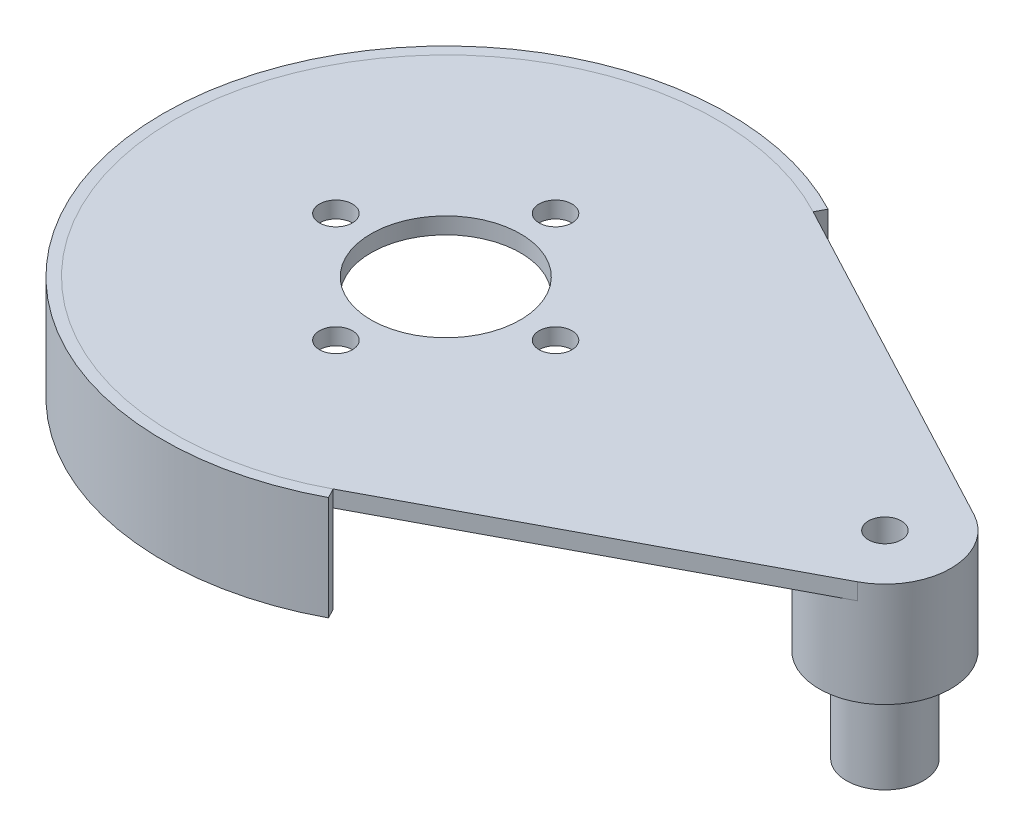
ISO-10303-21;
HEADER;
FILE_DESCRIPTION(('STEP AP214'),'2;1');
FILE_NAME('part.step','',(''),(''),'','','');
FILE_SCHEMA(('AUTOMOTIVE_DESIGN { 1 0 10303 214 1 1 1 1 }'));
ENDSEC;
DATA;
#1=APPLICATION_CONTEXT('core data for automotive mechanical design processes');
#2=APPLICATION_PROTOCOL_DEFINITION('international standard','automotive_design',2000,#1);
#3=PRODUCT_CONTEXT('',#1,'mechanical');
#4=PRODUCT('Part','Part','',(#3));
#5=PRODUCT_RELATED_PRODUCT_CATEGORY('part','',(#4));
#6=PRODUCT_DEFINITION_FORMATION('','',#4);
#7=PRODUCT_DEFINITION_CONTEXT('part definition',#1,'design');
#8=PRODUCT_DEFINITION('design','',#6,#7);
#9=PRODUCT_DEFINITION_SHAPE('','',#8);
#10=(LENGTH_UNIT() NAMED_UNIT(*) SI_UNIT(.MILLI.,.METRE.));
#11=(NAMED_UNIT(*) PLANE_ANGLE_UNIT() SI_UNIT($,.RADIAN.));
#12=(NAMED_UNIT(*) SI_UNIT($,.STERADIAN.) SOLID_ANGLE_UNIT());
#13=UNCERTAINTY_MEASURE_WITH_UNIT(LENGTH_MEASURE(1.E-05),#10,'distance_accuracy_value','');
#14=(GEOMETRIC_REPRESENTATION_CONTEXT(3) GLOBAL_UNCERTAINTY_ASSIGNED_CONTEXT((#13)) GLOBAL_UNIT_ASSIGNED_CONTEXT((#10,
#11,#12)) REPRESENTATION_CONTEXT('',''));
#15=CARTESIAN_POINT('',(0.,0.,0.));
#16=DIRECTION('',(0.,0.,1.));
#17=DIRECTION('',(1.,0.,0.));
#18=AXIS2_PLACEMENT_3D('',#15,#16,#17);
#19=CARTESIAN_POINT('',(0.,1.5,0.));
#20=DIRECTION('',(0.883330876568911,0.,-0.46875));
#21=DIRECTION('',(-0.46875,0.,-0.883330876568911));
#22=AXIS2_PLACEMENT_3D('',#19,#20,#21);
#23=PLANE('',#22);
#24=DIRECTION('',(0.,-1.,0.));
#25=VECTOR('',#24,1.);
#26=CARTESIAN_POINT('',(12.0703125,1.5,22.7457700716494));
#27=LINE('',#26,#25);
#28=CARTESIAN_POINT('',(12.0703125,1.5,22.7457700716494));
#29=VERTEX_POINT('',#28);
#30=CARTESIAN_POINT('',(12.0703125,-8.,22.7457700716494));
#31=VERTEX_POINT('',#30);
#32=EDGE_CURVE('E56',#29,#31,#27,.T.);
#33=ORIENTED_EDGE('',*,*,#32,.T.);
#34=DIRECTION('',(0.46875,0.,0.883330876568911));
#35=VECTOR('',#34,1.);
#36=CARTESIAN_POINT('',(0.,-8.,0.));
#37=LINE('',#36,#35);
#38=CARTESIAN_POINT('',(11.6015625,-8.,21.8624391950805));
#39=VERTEX_POINT('',#38);
#40=EDGE_CURVE('E93',#39,#31,#37,.T.);
#41=ORIENTED_EDGE('',*,*,#40,.F.);
#42=DIRECTION('',(0.,-1.,0.));
#43=VECTOR('',#42,1.);
#44=CARTESIAN_POINT('',(11.6015625,1.5,21.8624391950805));
#45=LINE('',#44,#43);
#46=CARTESIAN_POINT('',(11.6015625,1.5,21.8624391950805));
#47=VERTEX_POINT('',#46);
#48=EDGE_CURVE('E12',#47,#39,#45,.T.);
#49=ORIENTED_EDGE('',*,*,#48,.F.);
#50=DIRECTION('',(0.46875,0.,0.883330876568911));
#51=VECTOR('',#50,1.);
#52=CARTESIAN_POINT('',(0.,1.5,0.));
#53=LINE('',#52,#51);
#54=EDGE_CURVE('E95',#47,#29,#53,.T.);
#55=ORIENTED_EDGE('',*,*,#54,.T.);
#56=EDGE_LOOP('',(#33,#41,#49,#55));
#57=FACE_BOUND('',#56,.T.);
#58=ADVANCED_FACE('F53',(#57),#23,.T.);
#59=CARTESIAN_POINT('',(0.,1.5,0.));
#60=DIRECTION('',(0.,-1.,0.));
#61=DIRECTION('',(0.,0.,-1.));
#62=AXIS2_PLACEMENT_3D('',#59,#60,#61);
#63=CYLINDRICAL_SURFACE('',#62,24.75);
#64=ORIENTED_EDGE('',*,*,#48,.T.);
#65=CARTESIAN_POINT('',(0.,-8.,0.));
#66=DIRECTION('',(0.,-1.,0.));
#67=DIRECTION('',(0.,0.,-1.));
#68=AXIS2_PLACEMENT_3D('',#65,#66,#67);
#69=CIRCLE('',#68,24.75);
#70=CARTESIAN_POINT('',(11.6015625,-8.,-21.8624391950806));
#71=VERTEX_POINT('',#70);
#72=EDGE_CURVE('E111',#39,#71,#69,.T.);
#73=ORIENTED_EDGE('',*,*,#72,.T.);
#74=DIRECTION('',(0.,-1.,0.));
#75=VECTOR('',#74,1.);
#76=CARTESIAN_POINT('',(11.6015625,1.5,-21.8624391950806));
#77=LINE('',#76,#75);
#78=CARTESIAN_POINT('',(11.6015625,1.5,-21.8624391950806));
#79=VERTEX_POINT('',#78);
#80=EDGE_CURVE('E61',#79,#71,#77,.T.);
#81=ORIENTED_EDGE('',*,*,#80,.F.);
#82=CARTESIAN_POINT('',(0.,1.5,0.));
#83=DIRECTION('',(0.,-1.,0.));
#84=DIRECTION('',(0.,0.,-1.));
#85=AXIS2_PLACEMENT_3D('',#82,#83,#84);
#86=CIRCLE('',#85,24.75);
#87=EDGE_CURVE('E74',#47,#79,#86,.T.);
#88=ORIENTED_EDGE('',*,*,#87,.F.);
#89=EDGE_LOOP('',(#64,#73,#81,#88));
#90=FACE_BOUND('',#89,.T.);
#91=ADVANCED_FACE('F126',(#90),#63,.F.);
#92=CARTESIAN_POINT('',(0.,1.5,0.));
#93=DIRECTION('',(-0.88333087656891,0.,-0.468750000000001));
#94=DIRECTION('',(-0.468750000000001,0.,0.88333087656891));
#95=AXIS2_PLACEMENT_3D('',#92,#93,#94);
#96=PLANE('',#95);
#97=ORIENTED_EDGE('',*,*,#80,.T.);
#98=DIRECTION('',(0.468750000000001,0.,-0.88333087656891));
#99=VECTOR('',#98,1.);
#100=CARTESIAN_POINT('',(0.,-8.,0.));
#101=LINE('',#100,#99);
#102=CARTESIAN_POINT('',(12.0703125,-8.,-22.7457700716494));
#103=VERTEX_POINT('',#102);
#104=EDGE_CURVE('E107',#71,#103,#101,.T.);
#105=ORIENTED_EDGE('',*,*,#104,.T.);
#106=DIRECTION('',(0.,-1.,0.));
#107=VECTOR('',#106,1.);
#108=CARTESIAN_POINT('',(12.0703125,1.5,-22.7457700716494));
#109=LINE('',#108,#107);
#110=CARTESIAN_POINT('',(12.0703125,1.5,-22.7457700716494));
#111=VERTEX_POINT('',#110);
#112=EDGE_CURVE('E99',#111,#103,#109,.T.);
#113=ORIENTED_EDGE('',*,*,#112,.F.);
#114=DIRECTION('',(0.468750000000001,0.,-0.88333087656891));
#115=VECTOR('',#114,1.);
#116=CARTESIAN_POINT('',(0.,1.5,0.));
#117=LINE('',#116,#115);
#118=EDGE_CURVE('E119',#79,#111,#117,.T.);
#119=ORIENTED_EDGE('',*,*,#118,.F.);
#120=EDGE_LOOP('',(#97,#105,#113,#119));
#121=FACE_BOUND('',#120,.T.);
#122=ADVANCED_FACE('F124',(#121),#96,.F.);
#123=CARTESIAN_POINT('',(0.,1.5,0.));
#124=DIRECTION('',(0.,-1.,0.));
#125=DIRECTION('',(0.,0.,-1.));
#126=AXIS2_PLACEMENT_3D('',#123,#124,#125);
#127=CYLINDRICAL_SURFACE('',#126,25.75);
#128=ORIENTED_EDGE('',*,*,#112,.T.);
#129=CARTESIAN_POINT('',(0.,-8.,0.));
#130=DIRECTION('',(0.,-1.,0.));
#131=DIRECTION('',(0.,0.,-1.));
#132=AXIS2_PLACEMENT_3D('',#129,#130,#131);
#133=CIRCLE('',#132,25.75);
#134=EDGE_CURVE('E101',#31,#103,#133,.T.);
#135=ORIENTED_EDGE('',*,*,#134,.F.);
#136=ORIENTED_EDGE('',*,*,#32,.F.);
#137=CARTESIAN_POINT('',(0.,1.5,0.));
#138=DIRECTION('',(0.,-1.,0.));
#139=DIRECTION('',(0.,0.,-1.));
#140=AXIS2_PLACEMENT_3D('',#137,#138,#139);
#141=CIRCLE('',#140,25.75);
#142=EDGE_CURVE('E117',#29,#111,#141,.T.);
#143=ORIENTED_EDGE('',*,*,#142,.T.);
#144=EDGE_LOOP('',(#128,#135,#136,#143));
#145=FACE_BOUND('',#144,.T.);
#146=ADVANCED_FACE('F102',(#145),#127,.T.);
#147=CARTESIAN_POINT('',(0.,1.5,0.));
#148=DIRECTION('',(0.,-1.,0.));
#149=DIRECTION('',(0.,0.,-1.));
#150=AXIS2_PLACEMENT_3D('',#147,#148,#149);
#151=PLANE('',#150);
#152=ORIENTED_EDGE('',*,*,#54,.F.);
#153=ORIENTED_EDGE('',*,*,#87,.T.);
#154=ORIENTED_EDGE('',*,*,#118,.T.);
#155=ORIENTED_EDGE('',*,*,#142,.F.);
#156=EDGE_LOOP('',(#152,#153,#154,#155));
#157=FACE_BOUND('',#156,.T.);
#158=ADVANCED_FACE('F127',(#157),#151,.F.);
#159=CARTESIAN_POINT('',(0.,-8.,0.));
#160=DIRECTION('',(0.,-1.,0.));
#161=DIRECTION('',(0.,0.,-1.));
#162=AXIS2_PLACEMENT_3D('',#159,#160,#161);
#163=PLANE('',#162);
#164=ORIENTED_EDGE('',*,*,#40,.T.);
#165=ORIENTED_EDGE('',*,*,#134,.T.);
#166=ORIENTED_EDGE('',*,*,#104,.F.);
#167=ORIENTED_EDGE('',*,*,#72,.F.);
#168=EDGE_LOOP('',(#164,#165,#166,#167));
#169=FACE_BOUND('',#168,.T.);
#170=ADVANCED_FACE('F109',(#169),#163,.T.);
#171=CLOSED_SHELL('',(#58,#91,#122,#146,#158,#170));
#172=MANIFOLD_SOLID_BREP('B2',#171);
#173=CARTESIAN_POINT('',(11.6015625,1.5,21.8624391950806));
#174=DIRECTION('',(-0.46875,0.,-0.88333087656891));
#175=DIRECTION('',(-0.883330876568911,0.,0.46875));
#176=AXIS2_PLACEMENT_3D('',#173,#174,#175);
#177=PLANE('',#176);
#178=DIRECTION('',(0.88333087656891,0.,-0.46875));
#179=VECTOR('',#178,1.);
#180=CARTESIAN_POINT('',(11.6015625,0.,21.8624391950806));
#181=LINE('',#180,#179);
#182=CARTESIAN_POINT('',(11.6015625,0.,21.8624391950805));
#183=VERTEX_POINT('',#182);
#184=CARTESIAN_POINT('',(42.8125,0.,5.29998525941346));
#185=VERTEX_POINT('',#184);
#186=EDGE_CURVE('E247',#183,#185,#181,.T.);
#187=ORIENTED_EDGE('',*,*,#186,.T.);
#188=DIRECTION('',(0.,-1.,0.));
#189=VECTOR('',#188,1.);
#190=CARTESIAN_POINT('',(42.8125,1.5,5.29998525941346));
#191=LINE('',#190,#189);
#192=CARTESIAN_POINT('',(42.8125,1.5,5.29998525941346));
#193=VERTEX_POINT('',#192);
#194=EDGE_CURVE('E253',#193,#185,#191,.T.);
#195=ORIENTED_EDGE('',*,*,#194,.F.);
#196=DIRECTION('',(0.88333087656891,0.,-0.46875));
#197=VECTOR('',#196,1.);
#198=CARTESIAN_POINT('',(11.6015625,1.5,21.8624391950806));
#199=LINE('',#198,#197);
#200=CARTESIAN_POINT('',(11.6015625,1.5,21.8624391950805));
#201=VERTEX_POINT('',#200);
#202=EDGE_CURVE('E280',#201,#193,#199,.T.);
#203=ORIENTED_EDGE('',*,*,#202,.F.);
#204=DIRECTION('',(0.,-1.,0.));
#205=VECTOR('',#204,1.);
#206=CARTESIAN_POINT('',(11.6015625,1.5,21.8624391950805));
#207=LINE('',#206,#205);
#208=EDGE_CURVE('E285',#201,#183,#207,.T.);
#209=ORIENTED_EDGE('',*,*,#208,.T.);
#210=EDGE_LOOP('',(#187,#195,#203,#209));
#211=FACE_BOUND('',#210,.T.);
#212=ADVANCED_FACE('F192',(#211),#177,.F.);
#213=CARTESIAN_POINT('',(40.,1.5,0.));
#214=DIRECTION('',(0.,-1.,0.));
#215=DIRECTION('',(0.,0.,-1.));
#216=AXIS2_PLACEMENT_3D('',#213,#214,#215);
#217=CYLINDRICAL_SURFACE('',#216,5.99999999999999);
#218=ORIENTED_EDGE('',*,*,#194,.T.);
#219=CARTESIAN_POINT('',(40.,0.,0.));
#220=DIRECTION('',(0.,-1.,0.));
#221=DIRECTION('',(0.,0.,-1.));
#222=AXIS2_PLACEMENT_3D('',#219,#220,#221);
#223=CIRCLE('',#222,5.99999999999999);
#224=CARTESIAN_POINT('',(42.8125,0.,-5.29998525941346));
#225=VERTEX_POINT('',#224);
#226=EDGE_CURVE('E201',#185,#225,#223,.T.);
#227=ORIENTED_EDGE('',*,*,#226,.T.);
#228=DIRECTION('',(0.,-1.,0.));
#229=VECTOR('',#228,1.);
#230=CARTESIAN_POINT('',(42.8125,1.5,-5.29998525941346));
#231=LINE('',#230,#229);
#232=CARTESIAN_POINT('',(42.8125,1.5,-5.29998525941346));
#233=VERTEX_POINT('',#232);
#234=EDGE_CURVE('E250',#233,#225,#231,.T.);
#235=ORIENTED_EDGE('',*,*,#234,.F.);
#236=CARTESIAN_POINT('',(40.,1.5,0.));
#237=DIRECTION('',(0.,1.,0.));
#238=DIRECTION('',(0.,0.,1.));
#239=AXIS2_PLACEMENT_3D('',#236,#237,#238);
#240=CIRCLE('',#239,5.99999999999999);
#241=EDGE_CURVE('E235',#193,#233,#240,.T.);
#242=ORIENTED_EDGE('',*,*,#241,.F.);
#243=EDGE_LOOP('',(#218,#227,#235,#242));
#244=FACE_BOUND('',#243,.T.);
#245=CARTESIAN_POINT('',(40.,-8.,0.));
#246=DIRECTION('',(0.,-1.,0.));
#247=DIRECTION('',(0.,0.,-1.));
#248=AXIS2_PLACEMENT_3D('',#245,#246,#247);
#249=CIRCLE('',#248,5.99999999999999);
#250=CARTESIAN_POINT('',(40.,-8.,-5.99999999999999));
#251=VERTEX_POINT('',#250);
#252=EDGE_CURVE('E263',#251,#251,#249,.T.);
#253=ORIENTED_EDGE('',*,*,#252,.F.);
#254=EDGE_LOOP('',(#253));
#255=FACE_BOUND('',#254,.T.);
#256=ADVANCED_FACE('F255',(#244,#255),#217,.T.);
#257=CARTESIAN_POINT('',(11.6015625,1.5,-21.8624391950806));
#258=DIRECTION('',(0.46875,0.,-0.88333087656891));
#259=DIRECTION('',(-0.883330876568911,0.,-0.46875));
#260=AXIS2_PLACEMENT_3D('',#257,#258,#259);
#261=PLANE('',#260);
#262=DIRECTION('',(0.88333087656891,0.,0.46875));
#263=VECTOR('',#262,1.);
#264=CARTESIAN_POINT('',(11.6015625,0.,-21.8624391950806));
#265=LINE('',#264,#263);
#266=CARTESIAN_POINT('',(11.6015625,0.,-21.8624391950805));
#267=VERTEX_POINT('',#266);
#268=EDGE_CURVE('E240',#267,#225,#265,.T.);
#269=ORIENTED_EDGE('',*,*,#268,.F.);
#270=DIRECTION('',(0.,-1.,0.));
#271=VECTOR('',#270,1.);
#272=CARTESIAN_POINT('',(11.6015625,1.5,-21.8624391950805));
#273=LINE('',#272,#271);
#274=CARTESIAN_POINT('',(11.6015625,1.5,-21.8624391950805));
#275=VERTEX_POINT('',#274);
#276=EDGE_CURVE('E224',#275,#267,#273,.T.);
#277=ORIENTED_EDGE('',*,*,#276,.F.);
#278=DIRECTION('',(0.88333087656891,0.,0.46875));
#279=VECTOR('',#278,1.);
#280=CARTESIAN_POINT('',(11.6015625,1.5,-21.8624391950806));
#281=LINE('',#280,#279);
#282=EDGE_CURVE('E252',#275,#233,#281,.T.);
#283=ORIENTED_EDGE('',*,*,#282,.T.);
#284=ORIENTED_EDGE('',*,*,#234,.T.);
#285=EDGE_LOOP('',(#269,#277,#283,#284));
#286=FACE_BOUND('',#285,.T.);
#287=ADVANCED_FACE('F251',(#286),#261,.T.);
#288=CARTESIAN_POINT('',(0.,1.5,0.));
#289=DIRECTION('',(0.,-1.,0.));
#290=DIRECTION('',(0.,0.,-1.));
#291=AXIS2_PLACEMENT_3D('',#288,#289,#290);
#292=CYLINDRICAL_SURFACE('',#291,24.75);
#293=CARTESIAN_POINT('',(0.,0.,0.));
#294=DIRECTION('',(0.,1.,0.));
#295=DIRECTION('',(0.,0.,1.));
#296=AXIS2_PLACEMENT_3D('',#293,#294,#295);
#297=CIRCLE('',#296,24.75);
#298=EDGE_CURVE('E227',#267,#183,#297,.T.);
#299=ORIENTED_EDGE('',*,*,#298,.T.);
#300=ORIENTED_EDGE('',*,*,#208,.F.);
#301=CARTESIAN_POINT('',(0.,1.5,0.));
#302=DIRECTION('',(0.,1.,0.));
#303=DIRECTION('',(0.,0.,1.));
#304=AXIS2_PLACEMENT_3D('',#301,#302,#303);
#305=CIRCLE('',#304,24.75);
#306=EDGE_CURVE('E210',#275,#201,#305,.T.);
#307=ORIENTED_EDGE('',*,*,#306,.F.);
#308=ORIENTED_EDGE('',*,*,#276,.T.);
#309=EDGE_LOOP('',(#299,#300,#307,#308));
#310=FACE_BOUND('',#309,.T.);
#311=ADVANCED_FACE('F327',(#310),#292,.T.);
#312=CARTESIAN_POINT('',(0.,1.5,0.));
#313=DIRECTION('',(0.,1.,0.));
#314=DIRECTION('',(0.,0.,1.));
#315=AXIS2_PLACEMENT_3D('',#312,#313,#314);
#316=PLANE('',#315);
#317=CARTESIAN_POINT('',(40.,1.5,0.));
#318=DIRECTION('',(0.,-1.,0.));
#319=DIRECTION('',(0.,0.,-1.));
#320=AXIS2_PLACEMENT_3D('',#317,#318,#319);
#321=CIRCLE('',#320,1.5);
#322=CARTESIAN_POINT('',(40.,1.5,-1.5));
#323=VERTEX_POINT('',#322);
#324=EDGE_CURVE('E500',#323,#323,#321,.T.);
#325=ORIENTED_EDGE('',*,*,#324,.T.);
#326=EDGE_LOOP('',(#325));
#327=FACE_BOUND('',#326,.T.);
#328=CARTESIAN_POINT('',(0.,1.5,-10.));
#329=DIRECTION('',(0.,1.,0.));
#330=DIRECTION('',(0.,0.,1.));
#331=AXIS2_PLACEMENT_3D('',#328,#329,#330);
#332=CIRCLE('',#331,1.5);
#333=CARTESIAN_POINT('',(0.,1.5,-8.5));
#334=VERTEX_POINT('',#333);
#335=EDGE_CURVE('E271',#334,#334,#332,.T.);
#336=ORIENTED_EDGE('',*,*,#335,.F.);
#337=EDGE_LOOP('',(#336));
#338=FACE_BOUND('',#337,.T.);
#339=CARTESIAN_POINT('',(10.0000000000003,1.5,-2.82380124105319E-13));
#340=DIRECTION('',(0.,1.,0.));
#341=DIRECTION('',(0.,0.,1.));
#342=AXIS2_PLACEMENT_3D('',#339,#340,#341);
#343=CIRCLE('',#342,1.50000000000022);
#344=CARTESIAN_POINT('',(10.0000000000003,1.5,1.49999999999994));
#345=VERTEX_POINT('',#344);
#346=EDGE_CURVE('E267',#345,#345,#343,.T.);
#347=ORIENTED_EDGE('',*,*,#346,.F.);
#348=EDGE_LOOP('',(#347));
#349=FACE_BOUND('',#348,.T.);
#350=CARTESIAN_POINT('',(5.64760248210638E-13,1.5,10.));
#351=DIRECTION('',(0.,1.,0.));
#352=DIRECTION('',(0.,0.,1.));
#353=AXIS2_PLACEMENT_3D('',#350,#351,#352);
#354=CIRCLE('',#353,1.50000000000061);
#355=CARTESIAN_POINT('',(5.64760248210638E-13,1.5,11.5000000000006));
#356=VERTEX_POINT('',#355);
#357=EDGE_CURVE('E264',#356,#356,#354,.T.);
#358=ORIENTED_EDGE('',*,*,#357,.F.);
#359=EDGE_LOOP('',(#358));
#360=FACE_BOUND('',#359,.T.);
#361=CARTESIAN_POINT('',(-9.99999999999972,1.5,2.83604770904466E-13));
#362=DIRECTION('',(0.,1.,0.));
#363=DIRECTION('',(0.,0.,1.));
#364=AXIS2_PLACEMENT_3D('',#361,#362,#363);
#365=CIRCLE('',#364,1.50000000000045);
#366=CARTESIAN_POINT('',(-9.99999999999972,1.5,1.50000000000074));
#367=VERTEX_POINT('',#366);
#368=EDGE_CURVE('E268',#367,#367,#365,.T.);
#369=ORIENTED_EDGE('',*,*,#368,.F.);
#370=EDGE_LOOP('',(#369));
#371=FACE_BOUND('',#370,.T.);
#372=CARTESIAN_POINT('',(0.,1.5,0.));
#373=DIRECTION('',(0.,1.,0.));
#374=DIRECTION('',(0.,0.,1.));
#375=AXIS2_PLACEMENT_3D('',#372,#373,#374);
#376=CIRCLE('',#375,6.8);
#377=CARTESIAN_POINT('',(0.,1.5,6.8));
#378=VERTEX_POINT('',#377);
#379=EDGE_CURVE('E274',#378,#378,#376,.T.);
#380=ORIENTED_EDGE('',*,*,#379,.F.);
#381=EDGE_LOOP('',(#380));
#382=FACE_BOUND('',#381,.T.);
#383=ORIENTED_EDGE('',*,*,#202,.T.);
#384=ORIENTED_EDGE('',*,*,#241,.T.);
#385=ORIENTED_EDGE('',*,*,#282,.F.);
#386=ORIENTED_EDGE('',*,*,#306,.T.);
#387=EDGE_LOOP('',(#383,#384,#385,#386));
#388=FACE_BOUND('',#387,.T.);
#389=ADVANCED_FACE('F328',(#327,#338,#349,#360,#371,#382,#388),#316,.T.);
#390=CARTESIAN_POINT('',(0.,0.,0.));
#391=DIRECTION('',(0.,1.,0.));
#392=DIRECTION('',(0.,0.,1.));
#393=AXIS2_PLACEMENT_3D('',#390,#391,#392);
#394=PLANE('',#393);
#395=ORIENTED_EDGE('',*,*,#226,.F.);
#396=ORIENTED_EDGE('',*,*,#186,.F.);
#397=ORIENTED_EDGE('',*,*,#298,.F.);
#398=ORIENTED_EDGE('',*,*,#268,.T.);
#399=EDGE_LOOP('',(#395,#396,#397,#398));
#400=FACE_BOUND('',#399,.T.);
#401=CARTESIAN_POINT('',(0.,0.,-10.));
#402=DIRECTION('',(0.,1.,0.));
#403=DIRECTION('',(0.,0.,1.));
#404=AXIS2_PLACEMENT_3D('',#401,#402,#403);
#405=CIRCLE('',#404,1.5);
#406=CARTESIAN_POINT('',(0.,0.,-8.5));
#407=VERTEX_POINT('',#406);
#408=EDGE_CURVE('E195',#407,#407,#405,.T.);
#409=ORIENTED_EDGE('',*,*,#408,.T.);
#410=EDGE_LOOP('',(#409));
#411=FACE_BOUND('',#410,.T.);
#412=CARTESIAN_POINT('',(10.0000000000003,0.,-2.82380124105319E-13));
#413=DIRECTION('',(0.,1.,0.));
#414=DIRECTION('',(0.,0.,1.));
#415=AXIS2_PLACEMENT_3D('',#412,#413,#414);
#416=CIRCLE('',#415,1.50000000000022);
#417=CARTESIAN_POINT('',(10.0000000000003,0.,1.49999999999994));
#418=VERTEX_POINT('',#417);
#419=EDGE_CURVE('E297',#418,#418,#416,.T.);
#420=ORIENTED_EDGE('',*,*,#419,.T.);
#421=EDGE_LOOP('',(#420));
#422=FACE_BOUND('',#421,.T.);
#423=CARTESIAN_POINT('',(5.64760248210638E-13,0.,10.));
#424=DIRECTION('',(0.,1.,0.));
#425=DIRECTION('',(0.,0.,1.));
#426=AXIS2_PLACEMENT_3D('',#423,#424,#425);
#427=CIRCLE('',#426,1.50000000000061);
#428=CARTESIAN_POINT('',(5.64760248210638E-13,0.,11.5000000000006));
#429=VERTEX_POINT('',#428);
#430=EDGE_CURVE('E295',#429,#429,#427,.T.);
#431=ORIENTED_EDGE('',*,*,#430,.T.);
#432=EDGE_LOOP('',(#431));
#433=FACE_BOUND('',#432,.T.);
#434=CARTESIAN_POINT('',(-9.99999999999972,0.,2.83604770904466E-13));
#435=DIRECTION('',(0.,1.,0.));
#436=DIRECTION('',(0.,0.,1.));
#437=AXIS2_PLACEMENT_3D('',#434,#435,#436);
#438=CIRCLE('',#437,1.50000000000045);
#439=CARTESIAN_POINT('',(-9.99999999999972,0.,1.50000000000074));
#440=VERTEX_POINT('',#439);
#441=EDGE_CURVE('E292',#440,#440,#438,.T.);
#442=ORIENTED_EDGE('',*,*,#441,.T.);
#443=EDGE_LOOP('',(#442));
#444=FACE_BOUND('',#443,.T.);
#445=CARTESIAN_POINT('',(0.,0.,0.));
#446=DIRECTION('',(0.,1.,0.));
#447=DIRECTION('',(0.,0.,1.));
#448=AXIS2_PLACEMENT_3D('',#445,#446,#447);
#449=CIRCLE('',#448,6.8);
#450=CARTESIAN_POINT('',(0.,0.,6.8));
#451=VERTEX_POINT('',#450);
#452=EDGE_CURVE('E279',#451,#451,#449,.T.);
#453=ORIENTED_EDGE('',*,*,#452,.T.);
#454=EDGE_LOOP('',(#453));
#455=FACE_BOUND('',#454,.T.);
#456=ADVANCED_FACE('F242',(#400,#411,#422,#433,#444,#455),#394,.F.);
#457=CARTESIAN_POINT('',(0.,-8.,0.));
#458=DIRECTION('',(0.,1.,0.));
#459=DIRECTION('',(0.,0.,1.));
#460=AXIS2_PLACEMENT_3D('',#457,#458,#459);
#461=CYLINDRICAL_SURFACE('',#460,6.8);
#462=ORIENTED_EDGE('',*,*,#379,.T.);
#463=EDGE_LOOP('',(#462));
#464=FACE_BOUND('',#463,.T.);
#465=ORIENTED_EDGE('',*,*,#452,.F.);
#466=EDGE_LOOP('',(#465));
#467=FACE_BOUND('',#466,.T.);
#468=ADVANCED_FACE('F336',(#464,#467),#461,.F.);
#469=CARTESIAN_POINT('',(-9.99999999999972,-8.,2.83604770904466E-13));
#470=DIRECTION('',(0.,1.,0.));
#471=DIRECTION('',(0.,0.,1.));
#472=AXIS2_PLACEMENT_3D('',#469,#470,#471);
#473=CYLINDRICAL_SURFACE('',#472,1.50000000000045);
#474=ORIENTED_EDGE('',*,*,#368,.T.);
#475=EDGE_LOOP('',(#474));
#476=FACE_BOUND('',#475,.T.);
#477=ORIENTED_EDGE('',*,*,#441,.F.);
#478=EDGE_LOOP('',(#477));
#479=FACE_BOUND('',#478,.T.);
#480=ADVANCED_FACE('F363',(#476,#479),#473,.F.);
#481=CARTESIAN_POINT('',(5.64760248210638E-13,-8.,10.));
#482=DIRECTION('',(0.,1.,0.));
#483=DIRECTION('',(0.,0.,1.));
#484=AXIS2_PLACEMENT_3D('',#481,#482,#483);
#485=CYLINDRICAL_SURFACE('',#484,1.50000000000061);
#486=ORIENTED_EDGE('',*,*,#357,.T.);
#487=EDGE_LOOP('',(#486));
#488=FACE_BOUND('',#487,.T.);
#489=ORIENTED_EDGE('',*,*,#430,.F.);
#490=EDGE_LOOP('',(#489));
#491=FACE_BOUND('',#490,.T.);
#492=ADVANCED_FACE('F317',(#488,#491),#485,.F.);
#493=CARTESIAN_POINT('',(10.0000000000003,-8.,-2.82380124105319E-13));
#494=DIRECTION('',(0.,1.,0.));
#495=DIRECTION('',(0.,0.,1.));
#496=AXIS2_PLACEMENT_3D('',#493,#494,#495);
#497=CYLINDRICAL_SURFACE('',#496,1.50000000000022);
#498=ORIENTED_EDGE('',*,*,#346,.T.);
#499=EDGE_LOOP('',(#498));
#500=FACE_BOUND('',#499,.T.);
#501=ORIENTED_EDGE('',*,*,#419,.F.);
#502=EDGE_LOOP('',(#501));
#503=FACE_BOUND('',#502,.T.);
#504=ADVANCED_FACE('F307',(#500,#503),#497,.F.);
#505=CARTESIAN_POINT('',(0.,-8.,-10.));
#506=DIRECTION('',(0.,1.,0.));
#507=DIRECTION('',(0.,0.,1.));
#508=AXIS2_PLACEMENT_3D('',#505,#506,#507);
#509=CYLINDRICAL_SURFACE('',#508,1.5);
#510=ORIENTED_EDGE('',*,*,#335,.T.);
#511=EDGE_LOOP('',(#510));
#512=FACE_BOUND('',#511,.T.);
#513=ORIENTED_EDGE('',*,*,#408,.F.);
#514=EDGE_LOOP('',(#513));
#515=FACE_BOUND('',#514,.T.);
#516=ADVANCED_FACE('F304',(#512,#515),#509,.F.);
#517=CARTESIAN_POINT('',(40.,-8.,0.));
#518=DIRECTION('',(0.,-1.,0.));
#519=DIRECTION('',(0.,0.,-1.));
#520=AXIS2_PLACEMENT_3D('',#517,#518,#519);
#521=PLANE('',#520);
#522=CARTESIAN_POINT('',(40.,-8.,0.));
#523=DIRECTION('',(0.,-1.,0.));
#524=DIRECTION('',(0.,0.,-1.));
#525=AXIS2_PLACEMENT_3D('',#522,#523,#524);
#526=CIRCLE('',#525,3.5);
#527=CARTESIAN_POINT('',(40.,-8.,-3.5));
#528=VERTEX_POINT('',#527);
#529=EDGE_CURVE('E51',#528,#528,#526,.T.);
#530=ORIENTED_EDGE('',*,*,#529,.F.);
#531=EDGE_LOOP('',(#530));
#532=FACE_BOUND('',#531,.T.);
#533=ORIENTED_EDGE('',*,*,#252,.T.);
#534=EDGE_LOOP('',(#533));
#535=FACE_BOUND('',#534,.T.);
#536=ADVANCED_FACE('F306',(#532,#535),#521,.T.);
#537=CARTESIAN_POINT('',(40.,-16.5,0.));
#538=DIRECTION('',(0.,1.,0.));
#539=DIRECTION('',(0.,0.,1.));
#540=AXIS2_PLACEMENT_3D('',#537,#538,#539);
#541=CYLINDRICAL_SURFACE('',#540,3.5);
#542=CARTESIAN_POINT('',(40.,-16.5,0.));
#543=DIRECTION('',(0.,-1.,0.));
#544=DIRECTION('',(0.,0.,-1.));
#545=AXIS2_PLACEMENT_3D('',#542,#543,#544);
#546=CIRCLE('',#545,3.5);
#547=CARTESIAN_POINT('',(40.,-16.5,-3.5));
#548=VERTEX_POINT('',#547);
#549=EDGE_CURVE('E505',#548,#548,#546,.T.);
#550=ORIENTED_EDGE('',*,*,#549,.F.);
#551=EDGE_LOOP('',(#550));
#552=FACE_BOUND('',#551,.T.);
#553=ORIENTED_EDGE('',*,*,#529,.T.);
#554=EDGE_LOOP('',(#553));
#555=FACE_BOUND('',#554,.T.);
#556=ADVANCED_FACE('F314',(#552,#555),#541,.T.);
#557=CARTESIAN_POINT('',(40.,-16.5,0.));
#558=DIRECTION('',(0.,-1.,0.));
#559=DIRECTION('',(0.,0.,-1.));
#560=AXIS2_PLACEMENT_3D('',#557,#558,#559);
#561=PLANE('',#560);
#562=CARTESIAN_POINT('',(40.,-16.5,0.));
#563=DIRECTION('',(0.,-1.,0.));
#564=DIRECTION('',(0.,0.,-1.));
#565=AXIS2_PLACEMENT_3D('',#562,#563,#564);
#566=CIRCLE('',#565,1.5);
#567=CARTESIAN_POINT('',(40.,-16.5,-1.5));
#568=VERTEX_POINT('',#567);
#569=EDGE_CURVE('E503',#568,#568,#566,.T.);
#570=ORIENTED_EDGE('',*,*,#569,.F.);
#571=EDGE_LOOP('',(#570));
#572=FACE_BOUND('',#571,.T.);
#573=ORIENTED_EDGE('',*,*,#549,.T.);
#574=EDGE_LOOP('',(#573));
#575=FACE_BOUND('',#574,.T.);
#576=ADVANCED_FACE('F427',(#572,#575),#561,.T.);
#577=CARTESIAN_POINT('',(40.,1.5,0.));
#578=DIRECTION('',(0.,-1.,0.));
#579=DIRECTION('',(0.,0.,-1.));
#580=AXIS2_PLACEMENT_3D('',#577,#578,#579);
#581=CYLINDRICAL_SURFACE('',#580,1.5);
#582=ORIENTED_EDGE('',*,*,#324,.F.);
#583=EDGE_LOOP('',(#582));
#584=FACE_BOUND('',#583,.T.);
#585=ORIENTED_EDGE('',*,*,#569,.T.);
#586=EDGE_LOOP('',(#585));
#587=FACE_BOUND('',#586,.T.);
#588=ADVANCED_FACE('F445',(#584,#587),#581,.F.);
#589=CLOSED_SHELL('',(#212,#256,#287,#311,#389,#456,#468,#480,#492,#504,#516,#536,#556,#576,#588));
#590=MANIFOLD_SOLID_BREP('B6',#589);
#591=ADVANCED_BREP_SHAPE_REPRESENTATION('',(#18,#172,#590),#14);
#592=SHAPE_DEFINITION_REPRESENTATION(#9,#591);
ENDSEC;
END-ISO-10303-21;
